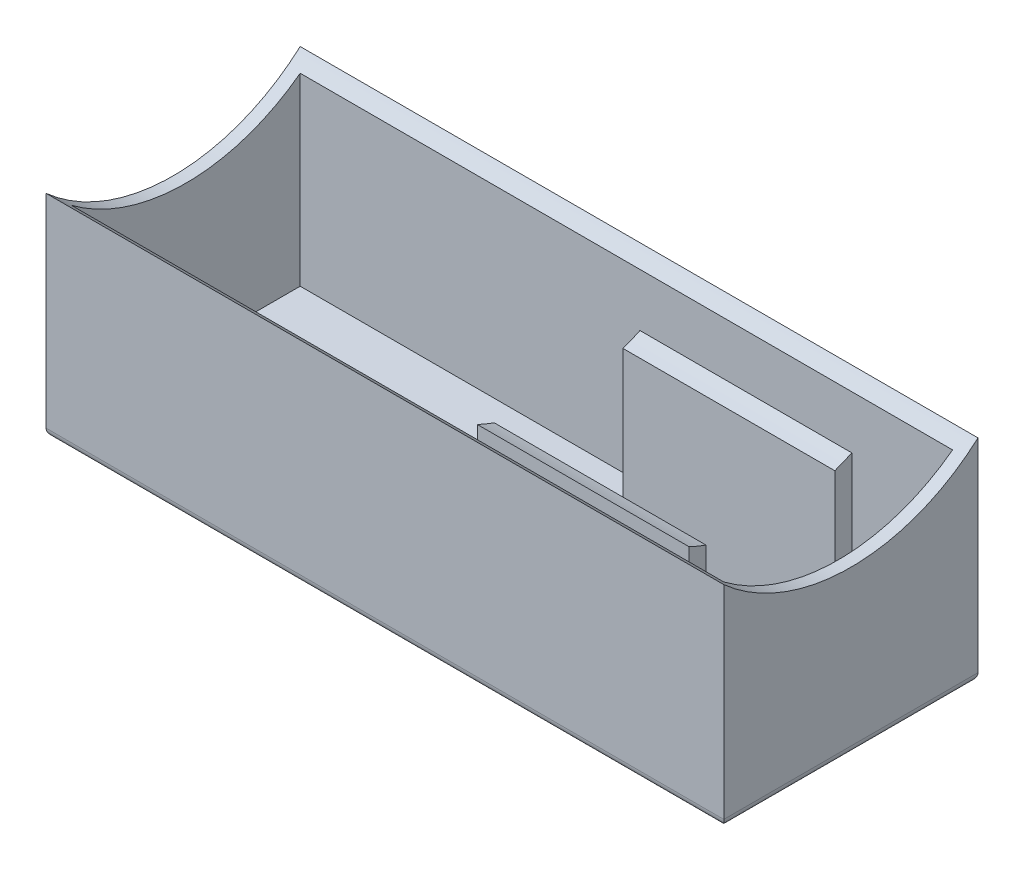
ISO-10303-21;
HEADER;
FILE_DESCRIPTION(('STEP AP214'),'2;1');
FILE_NAME('part.step','',(''),(''),'','','');
FILE_SCHEMA(('AUTOMOTIVE_DESIGN { 1 0 10303 214 1 1 1 1 }'));
ENDSEC;
DATA;
#1=APPLICATION_CONTEXT('core data for automotive mechanical design processes');
#2=APPLICATION_PROTOCOL_DEFINITION('international standard','automotive_design',2000,#1);
#3=PRODUCT_CONTEXT('',#1,'mechanical');
#4=PRODUCT('Part','Part','',(#3));
#5=PRODUCT_RELATED_PRODUCT_CATEGORY('part','',(#4));
#6=PRODUCT_DEFINITION_FORMATION('','',#4);
#7=PRODUCT_DEFINITION_CONTEXT('part definition',#1,'design');
#8=PRODUCT_DEFINITION('design','',#6,#7);
#9=PRODUCT_DEFINITION_SHAPE('','',#8);
#10=(LENGTH_UNIT() NAMED_UNIT(*) SI_UNIT(.MILLI.,.METRE.));
#11=(NAMED_UNIT(*) PLANE_ANGLE_UNIT() SI_UNIT($,.RADIAN.));
#12=(NAMED_UNIT(*) SI_UNIT($,.STERADIAN.) SOLID_ANGLE_UNIT());
#13=UNCERTAINTY_MEASURE_WITH_UNIT(LENGTH_MEASURE(1.E-05),#10,'distance_accuracy_value','');
#14=(GEOMETRIC_REPRESENTATION_CONTEXT(3) GLOBAL_UNCERTAINTY_ASSIGNED_CONTEXT((#13)) GLOBAL_UNIT_ASSIGNED_CONTEXT((#10,
#11,#12)) REPRESENTATION_CONTEXT('',''));
#15=CARTESIAN_POINT('',(0.,0.,0.));
#16=DIRECTION('',(0.,0.,1.));
#17=DIRECTION('',(1.,0.,0.));
#18=AXIS2_PLACEMENT_3D('',#15,#16,#17);
#19=CARTESIAN_POINT('',(0.,0.,0.));
#20=DIRECTION('',(0.,1.,0.));
#21=DIRECTION('',(0.,0.,1.));
#22=AXIS2_PLACEMENT_3D('',#19,#20,#21);
#23=PLANE('',#22);
#24=DIRECTION('',(1.,0.,0.));
#25=VECTOR('',#24,1.);
#26=CARTESIAN_POINT('',(40.,0.,-14.));
#27=LINE('',#26,#25);
#28=CARTESIAN_POINT('',(-39.,0.,-14.));
#29=VERTEX_POINT('',#28);
#30=CARTESIAN_POINT('',(39.,0.,-14.));
#31=VERTEX_POINT('',#30);
#32=EDGE_CURVE('E269',#29,#31,#27,.T.);
#33=ORIENTED_EDGE('',*,*,#32,.T.);
#34=DIRECTION('',(0.,0.,-1.));
#35=VECTOR('',#34,1.);
#36=CARTESIAN_POINT('',(39.,0.,0.));
#37=LINE('',#36,#35);
#38=CARTESIAN_POINT('',(39.,0.,14.));
#39=VERTEX_POINT('',#38);
#40=EDGE_CURVE('E271',#31,#39,#37,.F.);
#41=ORIENTED_EDGE('',*,*,#40,.T.);
#42=DIRECTION('',(1.,0.,0.));
#43=VECTOR('',#42,1.);
#44=CARTESIAN_POINT('',(0.,0.,14.));
#45=LINE('',#44,#43);
#46=CARTESIAN_POINT('',(-39.,0.,14.));
#47=VERTEX_POINT('',#46);
#48=EDGE_CURVE('E265',#39,#47,#45,.F.);
#49=ORIENTED_EDGE('',*,*,#48,.T.);
#50=DIRECTION('',(0.,0.,-1.));
#51=VECTOR('',#50,1.);
#52=CARTESIAN_POINT('',(-39.,0.,-15.));
#53=LINE('',#52,#51);
#54=EDGE_CURVE('E267',#47,#29,#53,.T.);
#55=ORIENTED_EDGE('',*,*,#54,.T.);
#56=EDGE_LOOP('',(#33,#41,#49,#55));
#57=FACE_BOUND('',#56,.T.);
#58=ADVANCED_FACE('F106',(#57),#23,.F.);
#59=CARTESIAN_POINT('',(40.,2.,0.));
#60=DIRECTION('',(-1.,0.,0.));
#61=DIRECTION('',(0.,0.,1.));
#62=AXIS2_PLACEMENT_3D('',#59,#60,#61);
#63=PLANE('',#62);
#64=DIRECTION('',(0.,-1.,0.));
#65=VECTOR('',#64,1.);
#66=CARTESIAN_POINT('',(40.,2.,15.));
#67=LINE('',#66,#65);
#68=CARTESIAN_POINT('',(40.,25.,15.));
#69=VERTEX_POINT('',#68);
#70=CARTESIAN_POINT('',(40.,1.,15.));
#71=VERTEX_POINT('',#70);
#72=EDGE_CURVE('E252',#69,#71,#67,.T.);
#73=ORIENTED_EDGE('',*,*,#72,.T.);
#74=DIRECTION('',(0.,0.,-1.));
#75=VECTOR('',#74,1.);
#76=CARTESIAN_POINT('',(40.,1.,0.));
#77=LINE('',#76,#75);
#78=CARTESIAN_POINT('',(40.,1.,-15.));
#79=VERTEX_POINT('',#78);
#80=EDGE_CURVE('E262',#71,#79,#77,.T.);
#81=ORIENTED_EDGE('',*,*,#80,.T.);
#82=DIRECTION('',(0.,-1.,0.));
#83=VECTOR('',#82,1.);
#84=CARTESIAN_POINT('',(40.,2.,-15.));
#85=LINE('',#84,#83);
#86=CARTESIAN_POINT('',(40.,25.,-15.));
#87=VERTEX_POINT('',#86);
#88=EDGE_CURVE('E250',#87,#79,#85,.T.);
#89=ORIENTED_EDGE('',*,*,#88,.F.);
#90=CARTESIAN_POINT('',(40.,41.7705098312484,0.));
#91=DIRECTION('',(1.,0.,0.));
#92=DIRECTION('',(0.,0.,-1.));
#93=AXIS2_PLACEMENT_3D('',#90,#91,#92);
#94=CIRCLE('',#93,22.5);
#95=EDGE_CURVE('E238',#69,#87,#94,.T.);
#96=ORIENTED_EDGE('',*,*,#95,.F.);
#97=EDGE_LOOP('',(#73,#81,#89,#96));
#98=FACE_BOUND('',#97,.T.);
#99=ADVANCED_FACE('F419',(#98),#63,.F.);
#100=CARTESIAN_POINT('',(0.,2.,-15.));
#101=DIRECTION('',(0.,0.,-1.));
#102=DIRECTION('',(-1.,0.,0.));
#103=AXIS2_PLACEMENT_3D('',#100,#101,#102);
#104=PLANE('',#103);
#105=ORIENTED_EDGE('',*,*,#88,.T.);
#106=DIRECTION('',(1.,0.,0.));
#107=VECTOR('',#106,1.);
#108=CARTESIAN_POINT('',(-40.,1.,-15.));
#109=LINE('',#108,#107);
#110=CARTESIAN_POINT('',(-40.,1.,-15.));
#111=VERTEX_POINT('',#110);
#112=EDGE_CURVE('E130',#79,#111,#109,.F.);
#113=ORIENTED_EDGE('',*,*,#112,.T.);
#114=DIRECTION('',(0.,-1.,0.));
#115=VECTOR('',#114,1.);
#116=CARTESIAN_POINT('',(-40.,2.,-15.));
#117=LINE('',#116,#115);
#118=CARTESIAN_POINT('',(-40.,25.,-15.));
#119=VERTEX_POINT('',#118);
#120=EDGE_CURVE('E244',#119,#111,#117,.T.);
#121=ORIENTED_EDGE('',*,*,#120,.F.);
#122=DIRECTION('',(-1.,0.,0.));
#123=VECTOR('',#122,1.);
#124=CARTESIAN_POINT('',(-40.,25.,-15.));
#125=LINE('',#124,#123);
#126=EDGE_CURVE('E233',#87,#119,#125,.T.);
#127=ORIENTED_EDGE('',*,*,#126,.F.);
#128=EDGE_LOOP('',(#105,#113,#121,#127));
#129=FACE_BOUND('',#128,.T.);
#130=ADVANCED_FACE('F249',(#129),#104,.T.);
#131=CARTESIAN_POINT('',(-40.,2.,0.));
#132=DIRECTION('',(-1.,0.,0.));
#133=DIRECTION('',(0.,0.,1.));
#134=AXIS2_PLACEMENT_3D('',#131,#132,#133);
#135=PLANE('',#134);
#136=ORIENTED_EDGE('',*,*,#120,.T.);
#137=DIRECTION('',(0.,0.,-1.));
#138=VECTOR('',#137,1.);
#139=CARTESIAN_POINT('',(-40.,1.,15.));
#140=LINE('',#139,#138);
#141=CARTESIAN_POINT('',(-40.,1.,15.));
#142=VERTEX_POINT('',#141);
#143=EDGE_CURVE('E115',#111,#142,#140,.F.);
#144=ORIENTED_EDGE('',*,*,#143,.T.);
#145=DIRECTION('',(0.,-1.,0.));
#146=VECTOR('',#145,1.);
#147=CARTESIAN_POINT('',(-40.,2.,15.));
#148=LINE('',#147,#146);
#149=CARTESIAN_POINT('',(-40.,25.,15.));
#150=VERTEX_POINT('',#149);
#151=EDGE_CURVE('E245',#150,#142,#148,.T.);
#152=ORIENTED_EDGE('',*,*,#151,.F.);
#153=CARTESIAN_POINT('',(-40.,41.7705098312484,0.));
#154=DIRECTION('',(1.,0.,0.));
#155=DIRECTION('',(0.,0.,-1.));
#156=AXIS2_PLACEMENT_3D('',#153,#154,#155);
#157=CIRCLE('',#156,22.5);
#158=EDGE_CURVE('E236',#150,#119,#157,.T.);
#159=ORIENTED_EDGE('',*,*,#158,.T.);
#160=EDGE_LOOP('',(#136,#144,#152,#159));
#161=FACE_BOUND('',#160,.T.);
#162=ADVANCED_FACE('F243',(#161),#135,.T.);
#163=CARTESIAN_POINT('',(0.,2.,15.));
#164=DIRECTION('',(0.,0.,-1.));
#165=DIRECTION('',(-1.,0.,0.));
#166=AXIS2_PLACEMENT_3D('',#163,#164,#165);
#167=PLANE('',#166);
#168=ORIENTED_EDGE('',*,*,#151,.T.);
#169=DIRECTION('',(1.,0.,0.));
#170=VECTOR('',#169,1.);
#171=CARTESIAN_POINT('',(0.,1.,15.));
#172=LINE('',#171,#170);
#173=EDGE_CURVE('E12',#142,#71,#172,.T.);
#174=ORIENTED_EDGE('',*,*,#173,.T.);
#175=ORIENTED_EDGE('',*,*,#72,.F.);
#176=DIRECTION('',(1.,0.,0.));
#177=VECTOR('',#176,1.);
#178=CARTESIAN_POINT('',(-40.,25.,15.));
#179=LINE('',#178,#177);
#180=EDGE_CURVE('E240',#150,#69,#179,.T.);
#181=ORIENTED_EDGE('',*,*,#180,.F.);
#182=EDGE_LOOP('',(#168,#174,#175,#181));
#183=FACE_BOUND('',#182,.T.);
#184=ADVANCED_FACE('F399',(#183),#167,.F.);
#185=CARTESIAN_POINT('',(-40.,41.7705098312484,0.));
#186=DIRECTION('',(1.,0.,0.));
#187=DIRECTION('',(0.,0.,-1.));
#188=AXIS2_PLACEMENT_3D('',#185,#186,#187);
#189=CYLINDRICAL_SURFACE('',#188,22.5);
#190=DIRECTION('',(1.,0.,0.));
#191=VECTOR('',#190,1.);
#192=CARTESIAN_POINT('',(-40.,23.7705098312484,13.5));
#193=LINE('',#192,#191);
#194=CARTESIAN_POINT('',(38.5,23.7705098312484,13.5));
#195=VERTEX_POINT('',#194);
#196=CARTESIAN_POINT('',(-38.5,23.7705098312484,13.5));
#197=VERTEX_POINT('',#196);
#198=EDGE_CURVE('E314',#195,#197,#193,.F.);
#199=ORIENTED_EDGE('',*,*,#198,.T.);
#200=CARTESIAN_POINT('',(-38.5,41.7705098312484,0.));
#201=DIRECTION('',(1.,0.,0.));
#202=DIRECTION('',(0.,0.,-1.));
#203=AXIS2_PLACEMENT_3D('',#200,#201,#202);
#204=CIRCLE('',#203,22.5);
#205=CARTESIAN_POINT('',(-38.5,23.7705098312484,-13.5));
#206=VERTEX_POINT('',#205);
#207=EDGE_CURVE('E308',#197,#206,#204,.T.);
#208=ORIENTED_EDGE('',*,*,#207,.T.);
#209=DIRECTION('',(1.,0.,0.));
#210=VECTOR('',#209,1.);
#211=CARTESIAN_POINT('',(-40.,23.7705098312484,-13.5));
#212=LINE('',#211,#210);
#213=CARTESIAN_POINT('',(38.5,23.7705098312484,-13.5));
#214=VERTEX_POINT('',#213);
#215=EDGE_CURVE('E310',#206,#214,#212,.T.);
#216=ORIENTED_EDGE('',*,*,#215,.T.);
#217=CARTESIAN_POINT('',(38.5,41.7705098312484,0.));
#218=DIRECTION('',(-1.,0.,0.));
#219=DIRECTION('',(0.,0.,1.));
#220=AXIS2_PLACEMENT_3D('',#217,#218,#219);
#221=CIRCLE('',#220,22.5);
#222=EDGE_CURVE('E312',#214,#195,#221,.T.);
#223=ORIENTED_EDGE('',*,*,#222,.T.);
#224=EDGE_LOOP('',(#199,#208,#216,#223));
#225=FACE_BOUND('',#224,.T.);
#226=ORIENTED_EDGE('',*,*,#95,.T.);
#227=ORIENTED_EDGE('',*,*,#126,.T.);
#228=ORIENTED_EDGE('',*,*,#158,.F.);
#229=ORIENTED_EDGE('',*,*,#180,.T.);
#230=EDGE_LOOP('',(#226,#227,#228,#229));
#231=FACE_BOUND('',#230,.T.);
#232=ADVANCED_FACE('F235',(#225,#231),#189,.F.);
#233=CARTESIAN_POINT('',(30.5,50.0798724079689,0.));
#234=DIRECTION('',(1.,0.,0.));
#235=DIRECTION('',(0.,0.,-1.));
#236=AXIS2_PLACEMENT_3D('',#233,#234,#235);
#237=PLANE('',#236);
#238=CARTESIAN_POINT('',(30.5,41.7705098312484,0.));
#239=DIRECTION('',(1.,0.,0.));
#240=DIRECTION('',(0.,0.,-1.));
#241=AXIS2_PLACEMENT_3D('',#238,#239,#240);
#242=CIRCLE('',#241,22.5);
#243=CARTESIAN_POINT('',(30.5,20.5929273440994,-7.6));
#244=VERTEX_POINT('',#243);
#245=CARTESIAN_POINT('',(30.5,21.4213083727145,-9.6));
#246=VERTEX_POINT('',#245);
#247=EDGE_CURVE('E298',#244,#246,#242,.T.);
#248=ORIENTED_EDGE('',*,*,#247,.F.);
#249=DIRECTION('',(0.,-1.,0.));
#250=VECTOR('',#249,1.);
#251=CARTESIAN_POINT('',(30.5,50.0798724079689,-7.6));
#252=LINE('',#251,#250);
#253=CARTESIAN_POINT('',(30.5,2.,-7.6));
#254=VERTEX_POINT('',#253);
#255=EDGE_CURVE('E348',#244,#254,#252,.T.);
#256=ORIENTED_EDGE('',*,*,#255,.T.);
#257=DIRECTION('',(0.,0.,1.));
#258=VECTOR('',#257,1.);
#259=CARTESIAN_POINT('',(30.5,2.,0.));
#260=LINE('',#259,#258);
#261=CARTESIAN_POINT('',(30.5,2.,-9.6));
#262=VERTEX_POINT('',#261);
#263=EDGE_CURVE('E336',#262,#254,#260,.T.);
#264=ORIENTED_EDGE('',*,*,#263,.F.);
#265=DIRECTION('',(0.,-1.,0.));
#266=VECTOR('',#265,1.);
#267=CARTESIAN_POINT('',(30.5,50.0798724079689,-9.6));
#268=LINE('',#267,#266);
#269=EDGE_CURVE('E354',#246,#262,#268,.T.);
#270=ORIENTED_EDGE('',*,*,#269,.F.);
#271=EDGE_LOOP('',(#248,#256,#264,#270));
#272=FACE_BOUND('',#271,.T.);
#273=ADVANCED_FACE('F398',(#272),#237,.T.);
#274=CARTESIAN_POINT('',(0.,50.0798724079689,-9.6));
#275=DIRECTION('',(0.,0.,-1.));
#276=DIRECTION('',(-1.,0.,0.));
#277=AXIS2_PLACEMENT_3D('',#274,#275,#276);
#278=PLANE('',#277);
#279=DIRECTION('',(1.,0.,0.));
#280=VECTOR('',#279,1.);
#281=CARTESIAN_POINT('',(-40.,21.4213083727145,-9.6));
#282=LINE('',#281,#280);
#283=CARTESIAN_POINT('',(5.5,21.4213083727145,-9.6));
#284=VERTEX_POINT('',#283);
#285=EDGE_CURVE('E300',#246,#284,#282,.F.);
#286=ORIENTED_EDGE('',*,*,#285,.F.);
#287=ORIENTED_EDGE('',*,*,#269,.T.);
#288=DIRECTION('',(1.,0.,0.));
#289=VECTOR('',#288,1.);
#290=CARTESIAN_POINT('',(0.,2.,-9.6));
#291=LINE('',#290,#289);
#292=CARTESIAN_POINT('',(5.5,2.,-9.6));
#293=VERTEX_POINT('',#292);
#294=EDGE_CURVE('E339',#293,#262,#291,.T.);
#295=ORIENTED_EDGE('',*,*,#294,.F.);
#296=DIRECTION('',(0.,-1.,0.));
#297=VECTOR('',#296,1.);
#298=CARTESIAN_POINT('',(5.5,50.0798724079689,-9.6));
#299=LINE('',#298,#297);
#300=EDGE_CURVE('E352',#284,#293,#299,.T.);
#301=ORIENTED_EDGE('',*,*,#300,.F.);
#302=EDGE_LOOP('',(#286,#287,#295,#301));
#303=FACE_BOUND('',#302,.T.);
#304=ADVANCED_FACE('F407',(#303),#278,.T.);
#305=CARTESIAN_POINT('',(5.5,50.0798724079689,0.));
#306=DIRECTION('',(1.,0.,0.));
#307=DIRECTION('',(0.,0.,-1.));
#308=AXIS2_PLACEMENT_3D('',#305,#306,#307);
#309=PLANE('',#308);
#310=DIRECTION('',(0.,-1.,0.));
#311=VECTOR('',#310,1.);
#312=CARTESIAN_POINT('',(5.5,50.0798724079689,-7.6));
#313=LINE('',#312,#311);
#314=CARTESIAN_POINT('',(5.5,20.5929273440994,-7.6));
#315=VERTEX_POINT('',#314);
#316=CARTESIAN_POINT('',(5.5,2.,-7.6));
#317=VERTEX_POINT('',#316);
#318=EDGE_CURVE('E350',#315,#317,#313,.T.);
#319=ORIENTED_EDGE('',*,*,#318,.F.);
#320=CARTESIAN_POINT('',(5.5,41.7705098312484,0.));
#321=DIRECTION('',(1.,0.,0.));
#322=DIRECTION('',(0.,0.,-1.));
#323=AXIS2_PLACEMENT_3D('',#320,#321,#322);
#324=CIRCLE('',#323,22.5);
#325=EDGE_CURVE('E302',#315,#284,#324,.T.);
#326=ORIENTED_EDGE('',*,*,#325,.T.);
#327=ORIENTED_EDGE('',*,*,#300,.T.);
#328=DIRECTION('',(0.,0.,1.));
#329=VECTOR('',#328,1.);
#330=CARTESIAN_POINT('',(5.5,2.,0.));
#331=LINE('',#330,#329);
#332=EDGE_CURVE('E342',#293,#317,#331,.T.);
#333=ORIENTED_EDGE('',*,*,#332,.T.);
#334=EDGE_LOOP('',(#319,#326,#327,#333));
#335=FACE_BOUND('',#334,.T.);
#336=ADVANCED_FACE('F528',(#335),#309,.F.);
#337=CARTESIAN_POINT('',(0.,50.0798724079689,-7.6));
#338=DIRECTION('',(0.,0.,-1.));
#339=DIRECTION('',(-1.,0.,0.));
#340=AXIS2_PLACEMENT_3D('',#337,#338,#339);
#341=PLANE('',#340);
#342=ORIENTED_EDGE('',*,*,#255,.F.);
#343=DIRECTION('',(1.,0.,0.));
#344=VECTOR('',#343,1.);
#345=CARTESIAN_POINT('',(-40.,20.5929273440994,-7.6));
#346=LINE('',#345,#344);
#347=EDGE_CURVE('E305',#244,#315,#346,.F.);
#348=ORIENTED_EDGE('',*,*,#347,.T.);
#349=ORIENTED_EDGE('',*,*,#318,.T.);
#350=DIRECTION('',(1.,0.,0.));
#351=VECTOR('',#350,1.);
#352=CARTESIAN_POINT('',(0.,2.,-7.6));
#353=LINE('',#352,#351);
#354=EDGE_CURVE('E345',#317,#254,#353,.T.);
#355=ORIENTED_EDGE('',*,*,#354,.T.);
#356=EDGE_LOOP('',(#342,#348,#349,#355));
#357=FACE_BOUND('',#356,.T.);
#358=ADVANCED_FACE('F521',(#357),#341,.F.);
#359=CARTESIAN_POINT('',(-38.5,25.,13.5));
#360=DIRECTION('',(1.,0.,0.));
#361=DIRECTION('',(0.,0.,-1.));
#362=AXIS2_PLACEMENT_3D('',#359,#360,#361);
#363=PLANE('',#362);
#364=ORIENTED_EDGE('',*,*,#207,.F.);
#365=DIRECTION('',(0.,-1.,0.));
#366=VECTOR('',#365,1.);
#367=CARTESIAN_POINT('',(-38.5,25.,13.5));
#368=LINE('',#367,#366);
#369=CARTESIAN_POINT('',(-38.5,2.,13.5));
#370=VERTEX_POINT('',#369);
#371=EDGE_CURVE('E356',#197,#370,#368,.T.);
#372=ORIENTED_EDGE('',*,*,#371,.T.);
#373=DIRECTION('',(0.,0.,-1.));
#374=VECTOR('',#373,1.);
#375=CARTESIAN_POINT('',(-38.5,2.,0.));
#376=LINE('',#375,#374);
#377=CARTESIAN_POINT('',(-38.5,2.,-13.5));
#378=VERTEX_POINT('',#377);
#379=EDGE_CURVE('E364',#370,#378,#376,.T.);
#380=ORIENTED_EDGE('',*,*,#379,.T.);
#381=DIRECTION('',(0.,-1.,0.));
#382=VECTOR('',#381,1.);
#383=CARTESIAN_POINT('',(-38.5,25.,-13.5));
#384=LINE('',#383,#382);
#385=EDGE_CURVE('E358',#206,#378,#384,.T.);
#386=ORIENTED_EDGE('',*,*,#385,.F.);
#387=EDGE_LOOP('',(#364,#372,#380,#386));
#388=FACE_BOUND('',#387,.T.);
#389=ADVANCED_FACE('F395',(#388),#363,.T.);
#390=CARTESIAN_POINT('',(-38.5,25.,-13.5));
#391=DIRECTION('',(0.,0.,1.));
#392=DIRECTION('',(1.,0.,0.));
#393=AXIS2_PLACEMENT_3D('',#390,#391,#392);
#394=PLANE('',#393);
#395=ORIENTED_EDGE('',*,*,#215,.F.);
#396=ORIENTED_EDGE('',*,*,#385,.T.);
#397=DIRECTION('',(1.,0.,0.));
#398=VECTOR('',#397,1.);
#399=CARTESIAN_POINT('',(0.,2.,-13.5));
#400=LINE('',#399,#398);
#401=CARTESIAN_POINT('',(38.5,2.,-13.5));
#402=VERTEX_POINT('',#401);
#403=EDGE_CURVE('E367',#378,#402,#400,.T.);
#404=ORIENTED_EDGE('',*,*,#403,.T.);
#405=DIRECTION('',(0.,-1.,0.));
#406=VECTOR('',#405,1.);
#407=CARTESIAN_POINT('',(38.5,25.,-13.5));
#408=LINE('',#407,#406);
#409=EDGE_CURVE('E360',#214,#402,#408,.T.);
#410=ORIENTED_EDGE('',*,*,#409,.F.);
#411=EDGE_LOOP('',(#395,#396,#404,#410));
#412=FACE_BOUND('',#411,.T.);
#413=ADVANCED_FACE('F391',(#412),#394,.T.);
#414=CARTESIAN_POINT('',(38.5,25.,13.5));
#415=DIRECTION('',(-1.,0.,0.));
#416=DIRECTION('',(0.,0.,1.));
#417=AXIS2_PLACEMENT_3D('',#414,#415,#416);
#418=PLANE('',#417);
#419=ORIENTED_EDGE('',*,*,#222,.F.);
#420=ORIENTED_EDGE('',*,*,#409,.T.);
#421=DIRECTION('',(0.,0.,1.));
#422=VECTOR('',#421,1.);
#423=CARTESIAN_POINT('',(38.5,2.,0.));
#424=LINE('',#423,#422);
#425=CARTESIAN_POINT('',(38.5,2.,13.5));
#426=VERTEX_POINT('',#425);
#427=EDGE_CURVE('E370',#402,#426,#424,.T.);
#428=ORIENTED_EDGE('',*,*,#427,.T.);
#429=DIRECTION('',(0.,-1.,0.));
#430=VECTOR('',#429,1.);
#431=CARTESIAN_POINT('',(38.5,25.,13.5));
#432=LINE('',#431,#430);
#433=EDGE_CURVE('E241',#195,#426,#432,.T.);
#434=ORIENTED_EDGE('',*,*,#433,.F.);
#435=EDGE_LOOP('',(#419,#420,#428,#434));
#436=FACE_BOUND('',#435,.T.);
#437=ADVANCED_FACE('F387',(#436),#418,.T.);
#438=CARTESIAN_POINT('',(-38.5,25.,13.5));
#439=DIRECTION('',(0.,0.,-1.));
#440=DIRECTION('',(-1.,0.,0.));
#441=AXIS2_PLACEMENT_3D('',#438,#439,#440);
#442=PLANE('',#441);
#443=ORIENTED_EDGE('',*,*,#198,.F.);
#444=ORIENTED_EDGE('',*,*,#433,.T.);
#445=DIRECTION('',(-1.,0.,0.));
#446=VECTOR('',#445,1.);
#447=CARTESIAN_POINT('',(0.,2.,13.5));
#448=LINE('',#447,#446);
#449=EDGE_CURVE('E254',#426,#370,#448,.T.);
#450=ORIENTED_EDGE('',*,*,#449,.T.);
#451=ORIENTED_EDGE('',*,*,#371,.F.);
#452=EDGE_LOOP('',(#443,#444,#450,#451));
#453=FACE_BOUND('',#452,.T.);
#454=ADVANCED_FACE('F377',(#453),#442,.T.);
#455=CARTESIAN_POINT('',(0.,2.,0.));
#456=DIRECTION('',(0.,1.,0.));
#457=DIRECTION('',(0.,0.,1.));
#458=AXIS2_PLACEMENT_3D('',#455,#456,#457);
#459=PLANE('',#458);
#460=ORIENTED_EDGE('',*,*,#449,.F.);
#461=ORIENTED_EDGE('',*,*,#427,.F.);
#462=ORIENTED_EDGE('',*,*,#403,.F.);
#463=ORIENTED_EDGE('',*,*,#379,.F.);
#464=EDGE_LOOP('',(#460,#461,#462,#463));
#465=FACE_BOUND('',#464,.T.);
#466=ORIENTED_EDGE('',*,*,#263,.T.);
#467=ORIENTED_EDGE('',*,*,#354,.F.);
#468=ORIENTED_EDGE('',*,*,#332,.F.);
#469=ORIENTED_EDGE('',*,*,#294,.T.);
#470=EDGE_LOOP('',(#466,#467,#468,#469));
#471=FACE_BOUND('',#470,.T.);
#472=DIRECTION('',(0.,0.,1.));
#473=VECTOR('',#472,1.);
#474=CARTESIAN_POINT('',(30.5,2.,0.));
#475=LINE('',#474,#473);
#476=CARTESIAN_POINT('',(30.5,2.,7.6));
#477=VERTEX_POINT('',#476);
#478=CARTESIAN_POINT('',(30.5,2.,9.6));
#479=VERTEX_POINT('',#478);
#480=EDGE_CURVE('E316',#477,#479,#475,.T.);
#481=ORIENTED_EDGE('',*,*,#480,.T.);
#482=DIRECTION('',(1.,0.,0.));
#483=VECTOR('',#482,1.);
#484=CARTESIAN_POINT('',(0.,2.,9.6));
#485=LINE('',#484,#483);
#486=CARTESIAN_POINT('',(5.5,2.,9.6));
#487=VERTEX_POINT('',#486);
#488=EDGE_CURVE('E325',#487,#479,#485,.T.);
#489=ORIENTED_EDGE('',*,*,#488,.F.);
#490=DIRECTION('',(0.,0.,1.));
#491=VECTOR('',#490,1.);
#492=CARTESIAN_POINT('',(5.5,2.,0.));
#493=LINE('',#492,#491);
#494=CARTESIAN_POINT('',(5.5,2.,7.6));
#495=VERTEX_POINT('',#494);
#496=EDGE_CURVE('E322',#495,#487,#493,.T.);
#497=ORIENTED_EDGE('',*,*,#496,.F.);
#498=DIRECTION('',(1.,0.,0.));
#499=VECTOR('',#498,1.);
#500=CARTESIAN_POINT('',(0.,2.,7.6));
#501=LINE('',#500,#499);
#502=EDGE_CURVE('E319',#495,#477,#501,.T.);
#503=ORIENTED_EDGE('',*,*,#502,.T.);
#504=EDGE_LOOP('',(#481,#489,#497,#503));
#505=FACE_BOUND('',#504,.T.);
#506=ADVANCED_FACE('F382',(#465,#471,#505),#459,.T.);
#507=CARTESIAN_POINT('',(30.5,50.0798724079689,0.));
#508=DIRECTION('',(1.,0.,0.));
#509=DIRECTION('',(0.,0.,-1.));
#510=AXIS2_PLACEMENT_3D('',#507,#508,#509);
#511=PLANE('',#510);
#512=CARTESIAN_POINT('',(30.5,41.7705098312484,0.));
#513=DIRECTION('',(1.,0.,0.));
#514=DIRECTION('',(0.,0.,-1.));
#515=AXIS2_PLACEMENT_3D('',#512,#513,#514);
#516=CIRCLE('',#515,22.5);
#517=CARTESIAN_POINT('',(30.5,21.4213083727145,9.6));
#518=VERTEX_POINT('',#517);
#519=CARTESIAN_POINT('',(30.5,20.5929273440994,7.6));
#520=VERTEX_POINT('',#519);
#521=EDGE_CURVE('E260',#518,#520,#516,.T.);
#522=ORIENTED_EDGE('',*,*,#521,.F.);
#523=DIRECTION('',(0.,-1.,0.));
#524=VECTOR('',#523,1.);
#525=CARTESIAN_POINT('',(30.5,50.0798724079689,9.6));
#526=LINE('',#525,#524);
#527=EDGE_CURVE('E328',#518,#479,#526,.T.);
#528=ORIENTED_EDGE('',*,*,#527,.T.);
#529=ORIENTED_EDGE('',*,*,#480,.F.);
#530=DIRECTION('',(0.,-1.,0.));
#531=VECTOR('',#530,1.);
#532=CARTESIAN_POINT('',(30.5,50.0798724079689,7.6));
#533=LINE('',#532,#531);
#534=EDGE_CURVE('E334',#520,#477,#533,.T.);
#535=ORIENTED_EDGE('',*,*,#534,.F.);
#536=EDGE_LOOP('',(#522,#528,#529,#535));
#537=FACE_BOUND('',#536,.T.);
#538=ADVANCED_FACE('F484',(#537),#511,.T.);
#539=CARTESIAN_POINT('',(0.,50.0798724079689,7.6));
#540=DIRECTION('',(0.,0.,-1.));
#541=DIRECTION('',(-1.,0.,0.));
#542=AXIS2_PLACEMENT_3D('',#539,#540,#541);
#543=PLANE('',#542);
#544=DIRECTION('',(1.,0.,0.));
#545=VECTOR('',#544,1.);
#546=CARTESIAN_POINT('',(-40.,20.5929273440994,7.6));
#547=LINE('',#546,#545);
#548=CARTESIAN_POINT('',(5.5,20.5929273440994,7.6));
#549=VERTEX_POINT('',#548);
#550=EDGE_CURVE('E247',#520,#549,#547,.F.);
#551=ORIENTED_EDGE('',*,*,#550,.F.);
#552=ORIENTED_EDGE('',*,*,#534,.T.);
#553=ORIENTED_EDGE('',*,*,#502,.F.);
#554=DIRECTION('',(0.,-1.,0.));
#555=VECTOR('',#554,1.);
#556=CARTESIAN_POINT('',(5.5,50.0798724079689,7.6));
#557=LINE('',#556,#555);
#558=EDGE_CURVE('E332',#549,#495,#557,.T.);
#559=ORIENTED_EDGE('',*,*,#558,.F.);
#560=EDGE_LOOP('',(#551,#552,#553,#559));
#561=FACE_BOUND('',#560,.T.);
#562=ADVANCED_FACE('F476',(#561),#543,.T.);
#563=CARTESIAN_POINT('',(5.5,50.0798724079689,0.));
#564=DIRECTION('',(1.,0.,0.));
#565=DIRECTION('',(0.,0.,-1.));
#566=AXIS2_PLACEMENT_3D('',#563,#564,#565);
#567=PLANE('',#566);
#568=DIRECTION('',(0.,-1.,0.));
#569=VECTOR('',#568,1.);
#570=CARTESIAN_POINT('',(5.5,50.0798724079689,9.6));
#571=LINE('',#570,#569);
#572=CARTESIAN_POINT('',(5.5,21.4213083727145,9.6));
#573=VERTEX_POINT('',#572);
#574=EDGE_CURVE('E330',#573,#487,#571,.T.);
#575=ORIENTED_EDGE('',*,*,#574,.F.);
#576=CARTESIAN_POINT('',(5.5,41.7705098312484,0.));
#577=DIRECTION('',(1.,0.,0.));
#578=DIRECTION('',(0.,0.,-1.));
#579=AXIS2_PLACEMENT_3D('',#576,#577,#578);
#580=CIRCLE('',#579,22.5);
#581=EDGE_CURVE('E292',#573,#549,#580,.T.);
#582=ORIENTED_EDGE('',*,*,#581,.T.);
#583=ORIENTED_EDGE('',*,*,#558,.T.);
#584=ORIENTED_EDGE('',*,*,#496,.T.);
#585=EDGE_LOOP('',(#575,#582,#583,#584));
#586=FACE_BOUND('',#585,.T.);
#587=ADVANCED_FACE('F469',(#586),#567,.F.);
#588=CARTESIAN_POINT('',(0.,50.0798724079689,9.6));
#589=DIRECTION('',(0.,0.,-1.));
#590=DIRECTION('',(-1.,0.,0.));
#591=AXIS2_PLACEMENT_3D('',#588,#589,#590);
#592=PLANE('',#591);
#593=ORIENTED_EDGE('',*,*,#527,.F.);
#594=DIRECTION('',(1.,0.,0.));
#595=VECTOR('',#594,1.);
#596=CARTESIAN_POINT('',(-40.,21.4213083727145,9.6));
#597=LINE('',#596,#595);
#598=EDGE_CURVE('E295',#518,#573,#597,.F.);
#599=ORIENTED_EDGE('',*,*,#598,.T.);
#600=ORIENTED_EDGE('',*,*,#574,.T.);
#601=ORIENTED_EDGE('',*,*,#488,.T.);
#602=EDGE_LOOP('',(#593,#599,#600,#601));
#603=FACE_BOUND('',#602,.T.);
#604=ADVANCED_FACE('F416',(#603),#592,.F.);
#605=ORIENTED_EDGE('',*,*,#521,.T.);
#606=ORIENTED_EDGE('',*,*,#550,.T.);
#607=ORIENTED_EDGE('',*,*,#581,.F.);
#608=ORIENTED_EDGE('',*,*,#598,.F.);
#609=EDGE_LOOP('',(#605,#606,#607,#608));
#610=FACE_BOUND('',#609,.T.);
#611=ADVANCED_FACE('F402',(#610),#189,.F.);
#612=ORIENTED_EDGE('',*,*,#247,.T.);
#613=ORIENTED_EDGE('',*,*,#285,.T.);
#614=ORIENTED_EDGE('',*,*,#325,.F.);
#615=ORIENTED_EDGE('',*,*,#347,.F.);
#616=EDGE_LOOP('',(#612,#613,#614,#615));
#617=FACE_BOUND('',#616,.T.);
#618=ADVANCED_FACE('F401',(#617),#189,.F.);
#619=CARTESIAN_POINT('',(-39.,1.,0.));
#620=DIRECTION('',(0.,0.,1.));
#621=DIRECTION('',(1.,0.,0.));
#622=AXIS2_PLACEMENT_3D('',#619,#620,#621);
#623=CYLINDRICAL_SURFACE('',#622,1.);
#624=CARTESIAN_POINT('',(-39.,1.,-14.));
#625=DIRECTION('',(-0.707106781186547,0.,0.707106781186547));
#626=DIRECTION('',(0.707106781186547,0.,0.707106781186547));
#627=AXIS2_PLACEMENT_3D('',#624,#625,#626);
#628=ELLIPSE('',#627,1.41421356237309,1.);
#629=EDGE_CURVE('E279',#29,#111,#628,.F.);
#630=ORIENTED_EDGE('',*,*,#629,.F.);
#631=ORIENTED_EDGE('',*,*,#54,.F.);
#632=CARTESIAN_POINT('',(-39.,1.,14.));
#633=DIRECTION('',(0.707106781186547,0.,0.707106781186547));
#634=DIRECTION('',(0.707106781186547,0.,-0.707106781186547));
#635=AXIS2_PLACEMENT_3D('',#632,#633,#634);
#636=ELLIPSE('',#635,1.41421356237309,1.);
#637=EDGE_CURVE('E110',#142,#47,#636,.T.);
#638=ORIENTED_EDGE('',*,*,#637,.F.);
#639=ORIENTED_EDGE('',*,*,#143,.F.);
#640=EDGE_LOOP('',(#630,#631,#638,#639));
#641=FACE_BOUND('',#640,.T.);
#642=ADVANCED_FACE('F108',(#641),#623,.T.);
#643=CARTESIAN_POINT('',(0.,1.,14.));
#644=DIRECTION('',(1.,0.,0.));
#645=DIRECTION('',(0.,0.,-1.));
#646=AXIS2_PLACEMENT_3D('',#643,#644,#645);
#647=CYLINDRICAL_SURFACE('',#646,1.);
#648=ORIENTED_EDGE('',*,*,#637,.T.);
#649=ORIENTED_EDGE('',*,*,#48,.F.);
#650=CARTESIAN_POINT('',(39.,1.,14.));
#651=DIRECTION('',(0.707106781186547,0.,-0.707106781186547));
#652=DIRECTION('',(0.707106781186547,0.,0.707106781186547));
#653=AXIS2_PLACEMENT_3D('',#650,#651,#652);
#654=ELLIPSE('',#653,1.41421356237309,1.);
#655=EDGE_CURVE('E278',#71,#39,#654,.T.);
#656=ORIENTED_EDGE('',*,*,#655,.F.);
#657=ORIENTED_EDGE('',*,*,#173,.F.);
#658=EDGE_LOOP('',(#648,#649,#656,#657));
#659=FACE_BOUND('',#658,.T.);
#660=ADVANCED_FACE('F440',(#659),#647,.T.);
#661=CARTESIAN_POINT('',(0.,1.,-14.));
#662=DIRECTION('',(-1.,0.,0.));
#663=DIRECTION('',(0.,0.,1.));
#664=AXIS2_PLACEMENT_3D('',#661,#662,#663);
#665=CYLINDRICAL_SURFACE('',#664,1.);
#666=ORIENTED_EDGE('',*,*,#629,.T.);
#667=ORIENTED_EDGE('',*,*,#112,.F.);
#668=CARTESIAN_POINT('',(39.,1.,-14.));
#669=DIRECTION('',(-0.707106781186547,0.,-0.707106781186547));
#670=DIRECTION('',(-0.707106781186547,0.,0.707106781186547));
#671=AXIS2_PLACEMENT_3D('',#668,#669,#670);
#672=ELLIPSE('',#671,1.41421356237309,1.);
#673=EDGE_CURVE('E276',#31,#79,#672,.F.);
#674=ORIENTED_EDGE('',*,*,#673,.F.);
#675=ORIENTED_EDGE('',*,*,#32,.F.);
#676=EDGE_LOOP('',(#666,#667,#674,#675));
#677=FACE_BOUND('',#676,.T.);
#678=ADVANCED_FACE('F437',(#677),#665,.T.);
#679=CARTESIAN_POINT('',(39.,1.,0.));
#680=DIRECTION('',(0.,0.,-1.));
#681=DIRECTION('',(-1.,0.,0.));
#682=AXIS2_PLACEMENT_3D('',#679,#680,#681);
#683=CYLINDRICAL_SURFACE('',#682,1.);
#684=ORIENTED_EDGE('',*,*,#655,.T.);
#685=ORIENTED_EDGE('',*,*,#40,.F.);
#686=ORIENTED_EDGE('',*,*,#673,.T.);
#687=ORIENTED_EDGE('',*,*,#80,.F.);
#688=EDGE_LOOP('',(#684,#685,#686,#687));
#689=FACE_BOUND('',#688,.T.);
#690=ADVANCED_FACE('F434',(#689),#683,.T.);
#691=CLOSED_SHELL('',(#58,#99,#130,#162,#184,#232,#273,#304,#336,#358,#389,#413,#437,#454,#506,
#538,#562,#587,#604,#611,#618,#642,#660,#678,#690));
#692=MANIFOLD_SOLID_BREP('B2',#691);
#693=ADVANCED_BREP_SHAPE_REPRESENTATION('',(#18,#692),#14);
#694=SHAPE_DEFINITION_REPRESENTATION(#9,#693);
ENDSEC;
END-ISO-10303-21;
